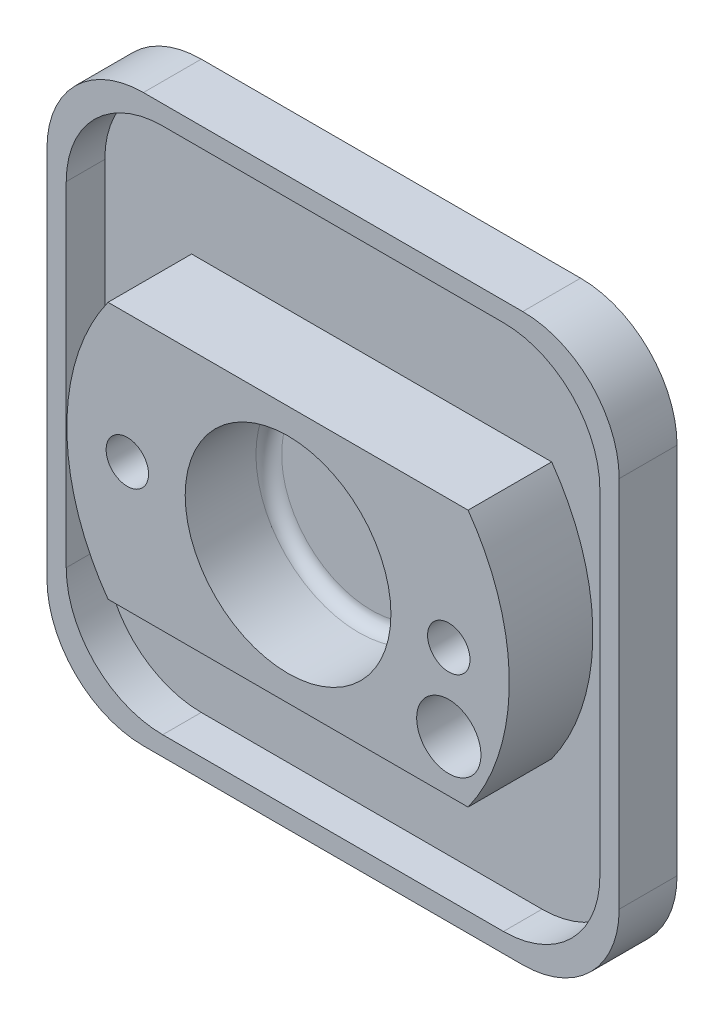
ISO-10303-21;
HEADER;
FILE_DESCRIPTION(('STEP AP214'),'2;1');
FILE_NAME('part.step','',(''),(''),'','','');
FILE_SCHEMA(('AUTOMOTIVE_DESIGN { 1 0 10303 214 1 1 1 1 }'));
ENDSEC;
DATA;
#1=APPLICATION_CONTEXT('core data for automotive mechanical design processes');
#2=APPLICATION_PROTOCOL_DEFINITION('international standard','automotive_design',2000,#1);
#3=PRODUCT_CONTEXT('',#1,'mechanical');
#4=PRODUCT('Part','Part','',(#3));
#5=PRODUCT_RELATED_PRODUCT_CATEGORY('part','',(#4));
#6=PRODUCT_DEFINITION_FORMATION('','',#4);
#7=PRODUCT_DEFINITION_CONTEXT('part definition',#1,'design');
#8=PRODUCT_DEFINITION('design','',#6,#7);
#9=PRODUCT_DEFINITION_SHAPE('','',#8);
#10=(LENGTH_UNIT() NAMED_UNIT(*) SI_UNIT(.MILLI.,.METRE.));
#11=(NAMED_UNIT(*) PLANE_ANGLE_UNIT() SI_UNIT($,.RADIAN.));
#12=(NAMED_UNIT(*) SI_UNIT($,.STERADIAN.) SOLID_ANGLE_UNIT());
#13=UNCERTAINTY_MEASURE_WITH_UNIT(LENGTH_MEASURE(1.E-05),#10,'distance_accuracy_value','');
#14=(GEOMETRIC_REPRESENTATION_CONTEXT(3) GLOBAL_UNCERTAINTY_ASSIGNED_CONTEXT((#13)) GLOBAL_UNIT_ASSIGNED_CONTEXT((#10,
#11,#12)) REPRESENTATION_CONTEXT('',''));
#15=CARTESIAN_POINT('',(0.,0.,0.));
#16=DIRECTION('',(0.,0.,1.));
#17=DIRECTION('',(1.,0.,0.));
#18=AXIS2_PLACEMENT_3D('',#15,#16,#17);
#19=CARTESIAN_POINT('',(-44.5,-44.,3.));
#20=DIRECTION('',(0.,0.,1.));
#21=DIRECTION('',(1.,0.,0.));
#22=AXIS2_PLACEMENT_3D('',#19,#20,#21);
#23=PLANE('',#22);
#24=DIRECTION('',(1.,0.,0.));
#25=VECTOR('',#24,1.);
#26=CARTESIAN_POINT('',(-44.5,-41.,3.));
#27=LINE('',#26,#25);
#28=CARTESIAN_POINT('',(-26.5,-41.,3.));
#29=VERTEX_POINT('',#28);
#30=CARTESIAN_POINT('',(26.5,-41.,3.));
#31=VERTEX_POINT('',#30);
#32=EDGE_CURVE('E200',#29,#31,#27,.T.);
#33=ORIENTED_EDGE('',*,*,#32,.T.);
#34=CARTESIAN_POINT('',(26.5,-26.,3.));
#35=DIRECTION('',(0.,0.,1.));
#36=DIRECTION('',(1.,0.,0.));
#37=AXIS2_PLACEMENT_3D('',#34,#35,#36);
#38=CIRCLE('',#37,15.);
#39=CARTESIAN_POINT('',(41.5,-26.,3.));
#40=VERTEX_POINT('',#39);
#41=EDGE_CURVE('E273',#31,#40,#38,.T.);
#42=ORIENTED_EDGE('',*,*,#41,.T.);
#43=DIRECTION('',(0.,1.,0.));
#44=VECTOR('',#43,1.);
#45=CARTESIAN_POINT('',(41.5,44.,3.));
#46=LINE('',#45,#44);
#47=CARTESIAN_POINT('',(41.5,26.,3.));
#48=VERTEX_POINT('',#47);
#49=EDGE_CURVE('E203',#40,#48,#46,.T.);
#50=ORIENTED_EDGE('',*,*,#49,.T.);
#51=CARTESIAN_POINT('',(26.5,26.,3.));
#52=DIRECTION('',(0.,0.,1.));
#53=DIRECTION('',(1.,0.,0.));
#54=AXIS2_PLACEMENT_3D('',#51,#52,#53);
#55=CIRCLE('',#54,15.);
#56=CARTESIAN_POINT('',(26.5,41.,3.));
#57=VERTEX_POINT('',#56);
#58=EDGE_CURVE('E254',#48,#57,#55,.T.);
#59=ORIENTED_EDGE('',*,*,#58,.T.);
#60=DIRECTION('',(-1.,0.,0.));
#61=VECTOR('',#60,1.);
#62=CARTESIAN_POINT('',(-44.5,41.,3.));
#63=LINE('',#62,#61);
#64=CARTESIAN_POINT('',(-26.5,41.,3.));
#65=VERTEX_POINT('',#64);
#66=EDGE_CURVE('E205',#57,#65,#63,.T.);
#67=ORIENTED_EDGE('',*,*,#66,.T.);
#68=CARTESIAN_POINT('',(-26.5,26.,3.));
#69=DIRECTION('',(0.,0.,1.));
#70=DIRECTION('',(1.,0.,0.));
#71=AXIS2_PLACEMENT_3D('',#68,#69,#70);
#72=CIRCLE('',#71,15.);
#73=CARTESIAN_POINT('',(-41.5,26.,3.));
#74=VERTEX_POINT('',#73);
#75=EDGE_CURVE('E244',#65,#74,#72,.T.);
#76=ORIENTED_EDGE('',*,*,#75,.T.);
#77=DIRECTION('',(0.,-1.,0.));
#78=VECTOR('',#77,1.);
#79=CARTESIAN_POINT('',(-41.5,44.,3.));
#80=LINE('',#79,#78);
#81=CARTESIAN_POINT('',(-41.5,-26.,3.));
#82=VERTEX_POINT('',#81);
#83=EDGE_CURVE('E165',#74,#82,#80,.T.);
#84=ORIENTED_EDGE('',*,*,#83,.T.);
#85=CARTESIAN_POINT('',(-26.5,-26.,3.));
#86=DIRECTION('',(0.,0.,1.));
#87=DIRECTION('',(1.,0.,0.));
#88=AXIS2_PLACEMENT_3D('',#85,#86,#87);
#89=CIRCLE('',#88,15.);
#90=EDGE_CURVE('E264',#82,#29,#89,.T.);
#91=ORIENTED_EDGE('',*,*,#90,.T.);
#92=EDGE_LOOP('',(#33,#42,#50,#59,#67,#76,#84,#91));
#93=FACE_BOUND('',#92,.T.);
#94=DIRECTION('',(-1.,0.,0.));
#95=VECTOR('',#94,1.);
#96=CARTESIAN_POINT('',(-28.,20.,3.));
#97=LINE('',#96,#95);
#98=CARTESIAN_POINT('',(28.,20.,3.));
#99=VERTEX_POINT('',#98);
#100=CARTESIAN_POINT('',(-28.,20.,3.));
#101=VERTEX_POINT('',#100);
#102=EDGE_CURVE('E159',#99,#101,#97,.T.);
#103=ORIENTED_EDGE('',*,*,#102,.F.);
#104=CARTESIAN_POINT('',(0.,0.,3.));
#105=DIRECTION('',(0.,0.,1.));
#106=DIRECTION('',(-1.,0.,0.));
#107=AXIS2_PLACEMENT_3D('',#104,#105,#106);
#108=CIRCLE('',#107,34.4093010681705);
#109=CARTESIAN_POINT('',(28.,-20.,3.));
#110=VERTEX_POINT('',#109);
#111=EDGE_CURVE('E170',#110,#99,#108,.T.);
#112=ORIENTED_EDGE('',*,*,#111,.F.);
#113=DIRECTION('',(1.,0.,0.));
#114=VECTOR('',#113,1.);
#115=CARTESIAN_POINT('',(-28.,-20.,3.));
#116=LINE('',#115,#114);
#117=CARTESIAN_POINT('',(-28.,-20.,3.));
#118=VERTEX_POINT('',#117);
#119=EDGE_CURVE('E182',#118,#110,#116,.T.);
#120=ORIENTED_EDGE('',*,*,#119,.F.);
#121=CARTESIAN_POINT('',(0.,0.,3.));
#122=DIRECTION('',(0.,0.,1.));
#123=DIRECTION('',(1.,0.,0.));
#124=AXIS2_PLACEMENT_3D('',#121,#122,#123);
#125=CIRCLE('',#124,34.4093010681705);
#126=EDGE_CURVE('E180',#101,#118,#125,.T.);
#127=ORIENTED_EDGE('',*,*,#126,.F.);
#128=EDGE_LOOP('',(#103,#112,#120,#127));
#129=FACE_BOUND('',#128,.T.);
#130=ADVANCED_FACE('F16',(#93,#129),#23,.T.);
#131=CARTESIAN_POINT('',(-44.5,44.,9.));
#132=DIRECTION('',(1.,0.,0.));
#133=DIRECTION('',(0.,1.,0.));
#134=AXIS2_PLACEMENT_3D('',#131,#132,#133);
#135=PLANE('',#134);
#136=DIRECTION('',(0.,-1.,0.));
#137=VECTOR('',#136,1.);
#138=CARTESIAN_POINT('',(-44.5,44.,0.));
#139=LINE('',#138,#137);
#140=CARTESIAN_POINT('',(-44.5,29.,0.));
#141=VERTEX_POINT('',#140);
#142=CARTESIAN_POINT('',(-44.5,-29.,0.));
#143=VERTEX_POINT('',#142);
#144=EDGE_CURVE('E217',#141,#143,#139,.T.);
#145=ORIENTED_EDGE('',*,*,#144,.T.);
#146=DIRECTION('',(0.,0.,-1.));
#147=VECTOR('',#146,1.);
#148=CARTESIAN_POINT('',(-44.5,-29.,9.));
#149=LINE('',#148,#147);
#150=CARTESIAN_POINT('',(-44.5,-29.,9.));
#151=VERTEX_POINT('',#150);
#152=EDGE_CURVE('E31',#143,#151,#149,.F.);
#153=ORIENTED_EDGE('',*,*,#152,.T.);
#154=DIRECTION('',(0.,-1.,0.));
#155=VECTOR('',#154,1.);
#156=CARTESIAN_POINT('',(-44.5,44.,9.));
#157=LINE('',#156,#155);
#158=CARTESIAN_POINT('',(-44.5,29.,9.));
#159=VERTEX_POINT('',#158);
#160=EDGE_CURVE('E226',#159,#151,#157,.T.);
#161=ORIENTED_EDGE('',*,*,#160,.F.);
#162=DIRECTION('',(0.,0.,-1.));
#163=VECTOR('',#162,1.);
#164=CARTESIAN_POINT('',(-44.5,29.,9.));
#165=LINE('',#164,#163);
#166=EDGE_CURVE('E301',#159,#141,#165,.T.);
#167=ORIENTED_EDGE('',*,*,#166,.T.);
#168=EDGE_LOOP('',(#145,#153,#161,#167));
#169=FACE_BOUND('',#168,.T.);
#170=ADVANCED_FACE('F18',(#169),#135,.F.);
#171=CARTESIAN_POINT('',(-44.5,-44.,9.));
#172=DIRECTION('',(0.,1.,0.));
#173=DIRECTION('',(0.,0.,1.));
#174=AXIS2_PLACEMENT_3D('',#171,#172,#173);
#175=PLANE('',#174);
#176=DIRECTION('',(1.,0.,0.));
#177=VECTOR('',#176,1.);
#178=CARTESIAN_POINT('',(-44.5,-44.,9.));
#179=LINE('',#178,#177);
#180=CARTESIAN_POINT('',(-29.5,-44.,9.));
#181=VERTEX_POINT('',#180);
#182=CARTESIAN_POINT('',(29.5,-44.,9.));
#183=VERTEX_POINT('',#182);
#184=EDGE_CURVE('E228',#181,#183,#179,.T.);
#185=ORIENTED_EDGE('',*,*,#184,.F.);
#186=DIRECTION('',(0.,0.,-1.));
#187=VECTOR('',#186,1.);
#188=CARTESIAN_POINT('',(-29.5,-44.,9.));
#189=LINE('',#188,#187);
#190=CARTESIAN_POINT('',(-29.5,-44.,0.));
#191=VERTEX_POINT('',#190);
#192=EDGE_CURVE('E310',#181,#191,#189,.T.);
#193=ORIENTED_EDGE('',*,*,#192,.T.);
#194=DIRECTION('',(1.,0.,0.));
#195=VECTOR('',#194,1.);
#196=CARTESIAN_POINT('',(-44.5,-44.,0.));
#197=LINE('',#196,#195);
#198=CARTESIAN_POINT('',(29.5,-44.,0.));
#199=VERTEX_POINT('',#198);
#200=EDGE_CURVE('E219',#191,#199,#197,.T.);
#201=ORIENTED_EDGE('',*,*,#200,.T.);
#202=DIRECTION('',(0.,0.,-1.));
#203=VECTOR('',#202,1.);
#204=CARTESIAN_POINT('',(29.5,-44.,9.));
#205=LINE('',#204,#203);
#206=EDGE_CURVE('E296',#199,#183,#205,.F.);
#207=ORIENTED_EDGE('',*,*,#206,.T.);
#208=EDGE_LOOP('',(#185,#193,#201,#207));
#209=FACE_BOUND('',#208,.T.);
#210=ADVANCED_FACE('F368',(#209),#175,.F.);
#211=CARTESIAN_POINT('',(44.5,44.,9.));
#212=DIRECTION('',(-1.,0.,0.));
#213=DIRECTION('',(0.,-1.,0.));
#214=AXIS2_PLACEMENT_3D('',#211,#212,#213);
#215=PLANE('',#214);
#216=DIRECTION('',(0.,1.,0.));
#217=VECTOR('',#216,1.);
#218=CARTESIAN_POINT('',(44.5,44.,9.));
#219=LINE('',#218,#217);
#220=CARTESIAN_POINT('',(44.5,-29.,9.));
#221=VERTEX_POINT('',#220);
#222=CARTESIAN_POINT('',(44.5,29.,9.));
#223=VERTEX_POINT('',#222);
#224=EDGE_CURVE('E230',#221,#223,#219,.T.);
#225=ORIENTED_EDGE('',*,*,#224,.F.);
#226=DIRECTION('',(0.,0.,-1.));
#227=VECTOR('',#226,1.);
#228=CARTESIAN_POINT('',(44.5,-29.,9.));
#229=LINE('',#228,#227);
#230=CARTESIAN_POINT('',(44.5,-29.,0.));
#231=VERTEX_POINT('',#230);
#232=EDGE_CURVE('E290',#221,#231,#229,.T.);
#233=ORIENTED_EDGE('',*,*,#232,.T.);
#234=DIRECTION('',(0.,1.,0.));
#235=VECTOR('',#234,1.);
#236=CARTESIAN_POINT('',(44.5,44.,0.));
#237=LINE('',#236,#235);
#238=CARTESIAN_POINT('',(44.5,29.,0.));
#239=VERTEX_POINT('',#238);
#240=EDGE_CURVE('E221',#231,#239,#237,.T.);
#241=ORIENTED_EDGE('',*,*,#240,.T.);
#242=DIRECTION('',(0.,0.,-1.));
#243=VECTOR('',#242,1.);
#244=CARTESIAN_POINT('',(44.5,29.,9.));
#245=LINE('',#244,#243);
#246=EDGE_CURVE('E285',#239,#223,#245,.F.);
#247=ORIENTED_EDGE('',*,*,#246,.T.);
#248=EDGE_LOOP('',(#225,#233,#241,#247));
#249=FACE_BOUND('',#248,.T.);
#250=ADVANCED_FACE('F390',(#249),#215,.F.);
#251=CARTESIAN_POINT('',(-44.5,44.,9.));
#252=DIRECTION('',(0.,-1.,0.));
#253=DIRECTION('',(0.,0.,-1.));
#254=AXIS2_PLACEMENT_3D('',#251,#252,#253);
#255=PLANE('',#254);
#256=DIRECTION('',(-1.,0.,0.));
#257=VECTOR('',#256,1.);
#258=CARTESIAN_POINT('',(-44.5,44.,0.));
#259=LINE('',#258,#257);
#260=CARTESIAN_POINT('',(29.5,44.,0.));
#261=VERTEX_POINT('',#260);
#262=CARTESIAN_POINT('',(-29.5,44.,0.));
#263=VERTEX_POINT('',#262);
#264=EDGE_CURVE('E223',#261,#263,#259,.T.);
#265=ORIENTED_EDGE('',*,*,#264,.T.);
#266=DIRECTION('',(0.,0.,-1.));
#267=VECTOR('',#266,1.);
#268=CARTESIAN_POINT('',(-29.5,44.,9.));
#269=LINE('',#268,#267);
#270=CARTESIAN_POINT('',(-29.5,44.,9.));
#271=VERTEX_POINT('',#270);
#272=EDGE_CURVE('E306',#263,#271,#269,.F.);
#273=ORIENTED_EDGE('',*,*,#272,.T.);
#274=DIRECTION('',(-1.,0.,0.));
#275=VECTOR('',#274,1.);
#276=CARTESIAN_POINT('',(-44.5,44.,9.));
#277=LINE('',#276,#275);
#278=CARTESIAN_POINT('',(29.5,44.,9.));
#279=VERTEX_POINT('',#278);
#280=EDGE_CURVE('E232',#279,#271,#277,.T.);
#281=ORIENTED_EDGE('',*,*,#280,.F.);
#282=DIRECTION('',(0.,0.,-1.));
#283=VECTOR('',#282,1.);
#284=CARTESIAN_POINT('',(29.5,44.,9.));
#285=LINE('',#284,#283);
#286=EDGE_CURVE('E279',#279,#261,#285,.T.);
#287=ORIENTED_EDGE('',*,*,#286,.T.);
#288=EDGE_LOOP('',(#265,#273,#281,#287));
#289=FACE_BOUND('',#288,.T.);
#290=ADVANCED_FACE('F381',(#289),#255,.F.);
#291=CARTESIAN_POINT('',(-44.5,-44.,9.));
#292=DIRECTION('',(0.,0.,1.));
#293=DIRECTION('',(1.,0.,0.));
#294=AXIS2_PLACEMENT_3D('',#291,#292,#293);
#295=PLANE('',#294);
#296=DIRECTION('',(0.,-1.,0.));
#297=VECTOR('',#296,1.);
#298=CARTESIAN_POINT('',(-41.5,44.,9.));
#299=LINE('',#298,#297);
#300=CARTESIAN_POINT('',(-41.5,26.,9.));
#301=VERTEX_POINT('',#300);
#302=CARTESIAN_POINT('',(-41.5,-26.,9.));
#303=VERTEX_POINT('',#302);
#304=EDGE_CURVE('E207',#301,#303,#299,.T.);
#305=ORIENTED_EDGE('',*,*,#304,.F.);
#306=CARTESIAN_POINT('',(-26.5,26.,9.));
#307=DIRECTION('',(0.,0.,1.));
#308=DIRECTION('',(1.,0.,0.));
#309=AXIS2_PLACEMENT_3D('',#306,#307,#308);
#310=CIRCLE('',#309,15.);
#311=CARTESIAN_POINT('',(-26.5,41.,9.));
#312=VERTEX_POINT('',#311);
#313=EDGE_CURVE('E248',#301,#312,#310,.F.);
#314=ORIENTED_EDGE('',*,*,#313,.T.);
#315=DIRECTION('',(-1.,0.,0.));
#316=VECTOR('',#315,1.);
#317=CARTESIAN_POINT('',(-44.5,41.,9.));
#318=LINE('',#317,#316);
#319=CARTESIAN_POINT('',(26.5,41.,9.));
#320=VERTEX_POINT('',#319);
#321=EDGE_CURVE('E215',#320,#312,#318,.T.);
#322=ORIENTED_EDGE('',*,*,#321,.F.);
#323=CARTESIAN_POINT('',(26.5,26.,9.));
#324=DIRECTION('',(0.,0.,1.));
#325=DIRECTION('',(1.,0.,0.));
#326=AXIS2_PLACEMENT_3D('',#323,#324,#325);
#327=CIRCLE('',#326,15.);
#328=CARTESIAN_POINT('',(41.5,26.,9.));
#329=VERTEX_POINT('',#328);
#330=EDGE_CURVE('E258',#320,#329,#327,.F.);
#331=ORIENTED_EDGE('',*,*,#330,.T.);
#332=DIRECTION('',(0.,1.,0.));
#333=VECTOR('',#332,1.);
#334=CARTESIAN_POINT('',(41.5,44.,9.));
#335=LINE('',#334,#333);
#336=CARTESIAN_POINT('',(41.5,-26.,9.));
#337=VERTEX_POINT('',#336);
#338=EDGE_CURVE('E213',#337,#329,#335,.T.);
#339=ORIENTED_EDGE('',*,*,#338,.F.);
#340=CARTESIAN_POINT('',(26.5,-26.,9.));
#341=DIRECTION('',(0.,0.,1.));
#342=DIRECTION('',(1.,0.,0.));
#343=AXIS2_PLACEMENT_3D('',#340,#341,#342);
#344=CIRCLE('',#343,15.);
#345=CARTESIAN_POINT('',(26.5,-41.,9.));
#346=VERTEX_POINT('',#345);
#347=EDGE_CURVE('E277',#337,#346,#344,.F.);
#348=ORIENTED_EDGE('',*,*,#347,.T.);
#349=DIRECTION('',(1.,0.,0.));
#350=VECTOR('',#349,1.);
#351=CARTESIAN_POINT('',(-44.5,-41.,9.));
#352=LINE('',#351,#350);
#353=CARTESIAN_POINT('',(-26.5,-41.,9.));
#354=VERTEX_POINT('',#353);
#355=EDGE_CURVE('E210',#354,#346,#352,.T.);
#356=ORIENTED_EDGE('',*,*,#355,.F.);
#357=CARTESIAN_POINT('',(-26.5,-26.,9.));
#358=DIRECTION('',(0.,0.,1.));
#359=DIRECTION('',(1.,0.,0.));
#360=AXIS2_PLACEMENT_3D('',#357,#358,#359);
#361=CIRCLE('',#360,15.);
#362=EDGE_CURVE('E268',#354,#303,#361,.F.);
#363=ORIENTED_EDGE('',*,*,#362,.T.);
#364=EDGE_LOOP('',(#305,#314,#322,#331,#339,#348,#356,#363));
#365=FACE_BOUND('',#364,.T.);
#366=ORIENTED_EDGE('',*,*,#160,.T.);
#367=CARTESIAN_POINT('',(-29.5,-29.,9.));
#368=DIRECTION('',(0.,0.,1.));
#369=DIRECTION('',(1.,0.,0.));
#370=AXIS2_PLACEMENT_3D('',#367,#368,#369);
#371=CIRCLE('',#370,15.);
#372=EDGE_CURVE('E315',#151,#181,#371,.T.);
#373=ORIENTED_EDGE('',*,*,#372,.T.);
#374=ORIENTED_EDGE('',*,*,#184,.T.);
#375=CARTESIAN_POINT('',(29.5,-29.,9.));
#376=DIRECTION('',(0.,0.,1.));
#377=DIRECTION('',(1.,0.,0.));
#378=AXIS2_PLACEMENT_3D('',#375,#376,#377);
#379=CIRCLE('',#378,15.);
#380=EDGE_CURVE('E299',#183,#221,#379,.T.);
#381=ORIENTED_EDGE('',*,*,#380,.T.);
#382=ORIENTED_EDGE('',*,*,#224,.T.);
#383=CARTESIAN_POINT('',(29.5,29.,9.));
#384=DIRECTION('',(0.,0.,1.));
#385=DIRECTION('',(1.,0.,0.));
#386=AXIS2_PLACEMENT_3D('',#383,#384,#385);
#387=CIRCLE('',#386,15.);
#388=EDGE_CURVE('E288',#223,#279,#387,.T.);
#389=ORIENTED_EDGE('',*,*,#388,.T.);
#390=ORIENTED_EDGE('',*,*,#280,.T.);
#391=CARTESIAN_POINT('',(-29.5,29.,9.));
#392=DIRECTION('',(0.,0.,1.));
#393=DIRECTION('',(1.,0.,0.));
#394=AXIS2_PLACEMENT_3D('',#391,#392,#393);
#395=CIRCLE('',#394,15.);
#396=EDGE_CURVE('E308',#271,#159,#395,.T.);
#397=ORIENTED_EDGE('',*,*,#396,.T.);
#398=EDGE_LOOP('',(#366,#373,#374,#381,#382,#389,#390,#397));
#399=FACE_BOUND('',#398,.T.);
#400=ADVANCED_FACE('F362',(#365,#399),#295,.T.);
#401=CARTESIAN_POINT('',(-44.5,-44.,0.));
#402=DIRECTION('',(0.,0.,1.));
#403=DIRECTION('',(1.,0.,0.));
#404=AXIS2_PLACEMENT_3D('',#401,#402,#403);
#405=PLANE('',#404);
#406=CARTESIAN_POINT('',(25.,0.,0.));
#407=DIRECTION('',(0.,0.,1.));
#408=DIRECTION('',(1.,0.,0.));
#409=AXIS2_PLACEMENT_3D('',#406,#407,#408);
#410=CIRCLE('',#409,6.3);
#411=CARTESIAN_POINT('',(31.3,0.,0.));
#412=VERTEX_POINT('',#411);
#413=EDGE_CURVE('E24',#412,#412,#410,.T.);
#414=ORIENTED_EDGE('',*,*,#413,.T.);
#415=EDGE_LOOP('',(#414));
#416=FACE_BOUND('',#415,.T.);
#417=CARTESIAN_POINT('',(-25.,0.,0.));
#418=DIRECTION('',(0.,0.,1.));
#419=DIRECTION('',(1.,0.,0.));
#420=AXIS2_PLACEMENT_3D('',#417,#418,#419);
#421=CIRCLE('',#420,6.3);
#422=CARTESIAN_POINT('',(-18.7,0.,0.));
#423=VERTEX_POINT('',#422);
#424=EDGE_CURVE('E320',#423,#423,#421,.T.);
#425=ORIENTED_EDGE('',*,*,#424,.T.);
#426=EDGE_LOOP('',(#425));
#427=FACE_BOUND('',#426,.T.);
#428=CARTESIAN_POINT('',(25.,-12.,0.));
#429=DIRECTION('',(0.,0.,-1.));
#430=DIRECTION('',(-1.,0.,0.));
#431=AXIS2_PLACEMENT_3D('',#428,#429,#430);
#432=CIRCLE('',#431,5.);
#433=CARTESIAN_POINT('',(20.,-12.,0.));
#434=VERTEX_POINT('',#433);
#435=EDGE_CURVE('E355',#434,#434,#432,.T.);
#436=ORIENTED_EDGE('',*,*,#435,.F.);
#437=EDGE_LOOP('',(#436));
#438=FACE_BOUND('',#437,.T.);
#439=ORIENTED_EDGE('',*,*,#200,.F.);
#440=CARTESIAN_POINT('',(-29.5,-29.,0.));
#441=DIRECTION('',(0.,0.,1.));
#442=DIRECTION('',(1.,0.,0.));
#443=AXIS2_PLACEMENT_3D('',#440,#441,#442);
#444=CIRCLE('',#443,15.);
#445=EDGE_CURVE('E39',#191,#143,#444,.F.);
#446=ORIENTED_EDGE('',*,*,#445,.T.);
#447=ORIENTED_EDGE('',*,*,#144,.F.);
#448=CARTESIAN_POINT('',(-29.5,29.,0.));
#449=DIRECTION('',(0.,0.,1.));
#450=DIRECTION('',(1.,0.,0.));
#451=AXIS2_PLACEMENT_3D('',#448,#449,#450);
#452=CIRCLE('',#451,15.);
#453=EDGE_CURVE('E304',#141,#263,#452,.F.);
#454=ORIENTED_EDGE('',*,*,#453,.T.);
#455=ORIENTED_EDGE('',*,*,#264,.F.);
#456=CARTESIAN_POINT('',(29.5,29.,0.));
#457=DIRECTION('',(0.,0.,1.));
#458=DIRECTION('',(1.,0.,0.));
#459=AXIS2_PLACEMENT_3D('',#456,#457,#458);
#460=CIRCLE('',#459,15.);
#461=EDGE_CURVE('E282',#261,#239,#460,.F.);
#462=ORIENTED_EDGE('',*,*,#461,.T.);
#463=ORIENTED_EDGE('',*,*,#240,.F.);
#464=CARTESIAN_POINT('',(29.5,-29.,0.));
#465=DIRECTION('',(0.,0.,1.));
#466=DIRECTION('',(1.,0.,0.));
#467=AXIS2_PLACEMENT_3D('',#464,#465,#466);
#468=CIRCLE('',#467,15.);
#469=EDGE_CURVE('E293',#231,#199,#468,.F.);
#470=ORIENTED_EDGE('',*,*,#469,.T.);
#471=EDGE_LOOP('',(#439,#446,#447,#454,#455,#462,#463,#470));
#472=FACE_BOUND('',#471,.T.);
#473=ADVANCED_FACE('F325',(#416,#427,#438,#472),#405,.F.);
#474=CARTESIAN_POINT('',(-41.5,44.,9.));
#475=DIRECTION('',(1.,0.,0.));
#476=DIRECTION('',(0.,1.,0.));
#477=AXIS2_PLACEMENT_3D('',#474,#475,#476);
#478=PLANE('',#477);
#479=ORIENTED_EDGE('',*,*,#304,.T.);
#480=DIRECTION('',(0.,0.,-1.));
#481=VECTOR('',#480,1.);
#482=CARTESIAN_POINT('',(-41.5,-26.,3.));
#483=LINE('',#482,#481);
#484=EDGE_CURVE('E261',#303,#82,#483,.T.);
#485=ORIENTED_EDGE('',*,*,#484,.T.);
#486=ORIENTED_EDGE('',*,*,#83,.F.);
#487=DIRECTION('',(0.,0.,-1.));
#488=VECTOR('',#487,1.);
#489=CARTESIAN_POINT('',(-41.5,26.,9.));
#490=LINE('',#489,#488);
#491=EDGE_CURVE('E246',#74,#301,#490,.F.);
#492=ORIENTED_EDGE('',*,*,#491,.T.);
#493=EDGE_LOOP('',(#479,#485,#486,#492));
#494=FACE_BOUND('',#493,.T.);
#495=ADVANCED_FACE('F361',(#494),#478,.T.);
#496=CARTESIAN_POINT('',(-44.5,-41.,9.));
#497=DIRECTION('',(0.,1.,0.));
#498=DIRECTION('',(0.,0.,1.));
#499=AXIS2_PLACEMENT_3D('',#496,#497,#498);
#500=PLANE('',#499);
#501=ORIENTED_EDGE('',*,*,#355,.T.);
#502=DIRECTION('',(0.,0.,-1.));
#503=VECTOR('',#502,1.);
#504=CARTESIAN_POINT('',(26.5,-41.,3.));
#505=LINE('',#504,#503);
#506=EDGE_CURVE('E270',#346,#31,#505,.T.);
#507=ORIENTED_EDGE('',*,*,#506,.T.);
#508=ORIENTED_EDGE('',*,*,#32,.F.);
#509=DIRECTION('',(0.,0.,-1.));
#510=VECTOR('',#509,1.);
#511=CARTESIAN_POINT('',(-26.5,-41.,9.));
#512=LINE('',#511,#510);
#513=EDGE_CURVE('E266',#29,#354,#512,.F.);
#514=ORIENTED_EDGE('',*,*,#513,.T.);
#515=EDGE_LOOP('',(#501,#507,#508,#514));
#516=FACE_BOUND('',#515,.T.);
#517=ADVANCED_FACE('F457',(#516),#500,.T.);
#518=CARTESIAN_POINT('',(41.5,44.,9.));
#519=DIRECTION('',(-1.,0.,0.));
#520=DIRECTION('',(0.,-1.,0.));
#521=AXIS2_PLACEMENT_3D('',#518,#519,#520);
#522=PLANE('',#521);
#523=ORIENTED_EDGE('',*,*,#49,.F.);
#524=DIRECTION('',(0.,0.,-1.));
#525=VECTOR('',#524,1.);
#526=CARTESIAN_POINT('',(41.5,-26.,9.));
#527=LINE('',#526,#525);
#528=EDGE_CURVE('E275',#40,#337,#527,.F.);
#529=ORIENTED_EDGE('',*,*,#528,.T.);
#530=ORIENTED_EDGE('',*,*,#338,.T.);
#531=DIRECTION('',(0.,0.,-1.));
#532=VECTOR('',#531,1.);
#533=CARTESIAN_POINT('',(41.5,26.,3.));
#534=LINE('',#533,#532);
#535=EDGE_CURVE('E251',#329,#48,#534,.T.);
#536=ORIENTED_EDGE('',*,*,#535,.T.);
#537=EDGE_LOOP('',(#523,#529,#530,#536));
#538=FACE_BOUND('',#537,.T.);
#539=ADVANCED_FACE('F442',(#538),#522,.T.);
#540=CARTESIAN_POINT('',(-44.5,41.,9.));
#541=DIRECTION('',(0.,-1.,0.));
#542=DIRECTION('',(0.,0.,-1.));
#543=AXIS2_PLACEMENT_3D('',#540,#541,#542);
#544=PLANE('',#543);
#545=ORIENTED_EDGE('',*,*,#66,.F.);
#546=DIRECTION('',(0.,0.,-1.));
#547=VECTOR('',#546,1.);
#548=CARTESIAN_POINT('',(26.5,41.,9.));
#549=LINE('',#548,#547);
#550=EDGE_CURVE('E256',#57,#320,#549,.F.);
#551=ORIENTED_EDGE('',*,*,#550,.T.);
#552=ORIENTED_EDGE('',*,*,#321,.T.);
#553=DIRECTION('',(0.,0.,-1.));
#554=VECTOR('',#553,1.);
#555=CARTESIAN_POINT('',(-26.5,41.,3.));
#556=LINE('',#555,#554);
#557=EDGE_CURVE('E241',#312,#65,#556,.T.);
#558=ORIENTED_EDGE('',*,*,#557,.T.);
#559=EDGE_LOOP('',(#545,#551,#552,#558));
#560=FACE_BOUND('',#559,.T.);
#561=ADVANCED_FACE('F434',(#560),#544,.T.);
#562=CARTESIAN_POINT('',(0.,0.,16.));
#563=DIRECTION('',(0.,0.,-1.));
#564=DIRECTION('',(-1.,0.,0.));
#565=AXIS2_PLACEMENT_3D('',#562,#563,#564);
#566=PLANE('',#565);
#567=CARTESIAN_POINT('',(25.,-12.,16.));
#568=DIRECTION('',(0.,0.,-1.));
#569=DIRECTION('',(-1.,0.,0.));
#570=AXIS2_PLACEMENT_3D('',#567,#568,#569);
#571=CIRCLE('',#570,5.);
#572=CARTESIAN_POINT('',(20.,-12.,16.));
#573=VERTEX_POINT('',#572);
#574=EDGE_CURVE('E350',#573,#573,#571,.T.);
#575=ORIENTED_EDGE('',*,*,#574,.T.);
#576=EDGE_LOOP('',(#575));
#577=FACE_BOUND('',#576,.T.);
#578=CARTESIAN_POINT('',(-25.,0.,16.));
#579=DIRECTION('',(0.,0.,-1.));
#580=DIRECTION('',(1.,0.,0.));
#581=AXIS2_PLACEMENT_3D('',#578,#579,#580);
#582=CIRCLE('',#581,3.3);
#583=CARTESIAN_POINT('',(-21.7,0.,16.));
#584=VERTEX_POINT('',#583);
#585=EDGE_CURVE('E346',#584,#584,#582,.T.);
#586=ORIENTED_EDGE('',*,*,#585,.T.);
#587=EDGE_LOOP('',(#586));
#588=FACE_BOUND('',#587,.T.);
#589=CARTESIAN_POINT('',(25.,0.,16.));
#590=DIRECTION('',(0.,0.,-1.));
#591=DIRECTION('',(-1.,0.,0.));
#592=AXIS2_PLACEMENT_3D('',#589,#590,#591);
#593=CIRCLE('',#592,3.3);
#594=CARTESIAN_POINT('',(21.7,0.,16.));
#595=VERTEX_POINT('',#594);
#596=EDGE_CURVE('E344',#595,#595,#593,.T.);
#597=ORIENTED_EDGE('',*,*,#596,.T.);
#598=EDGE_LOOP('',(#597));
#599=FACE_BOUND('',#598,.T.);
#600=CARTESIAN_POINT('',(0.,0.,16.));
#601=DIRECTION('',(0.,0.,1.));
#602=DIRECTION('',(-1.,0.,0.));
#603=AXIS2_PLACEMENT_3D('',#600,#601,#602);
#604=CIRCLE('',#603,34.4093010681705);
#605=CARTESIAN_POINT('',(28.,-20.,16.));
#606=VERTEX_POINT('',#605);
#607=CARTESIAN_POINT('',(28.,20.,16.));
#608=VERTEX_POINT('',#607);
#609=EDGE_CURVE('E187',#606,#608,#604,.T.);
#610=ORIENTED_EDGE('',*,*,#609,.T.);
#611=DIRECTION('',(-1.,0.,0.));
#612=VECTOR('',#611,1.);
#613=CARTESIAN_POINT('',(-28.,20.,16.));
#614=LINE('',#613,#612);
#615=CARTESIAN_POINT('',(-28.,20.,16.));
#616=VERTEX_POINT('',#615);
#617=EDGE_CURVE('E161',#608,#616,#614,.T.);
#618=ORIENTED_EDGE('',*,*,#617,.T.);
#619=CARTESIAN_POINT('',(0.,0.,16.));
#620=DIRECTION('',(0.,0.,1.));
#621=DIRECTION('',(1.,0.,0.));
#622=AXIS2_PLACEMENT_3D('',#619,#620,#621);
#623=CIRCLE('',#622,34.4093010681705);
#624=CARTESIAN_POINT('',(-28.,-20.,16.));
#625=VERTEX_POINT('',#624);
#626=EDGE_CURVE('E190',#616,#625,#623,.T.);
#627=ORIENTED_EDGE('',*,*,#626,.T.);
#628=DIRECTION('',(1.,0.,0.));
#629=VECTOR('',#628,1.);
#630=CARTESIAN_POINT('',(-28.,-20.,16.));
#631=LINE('',#630,#629);
#632=EDGE_CURVE('E192',#625,#606,#631,.T.);
#633=ORIENTED_EDGE('',*,*,#632,.T.);
#634=EDGE_LOOP('',(#610,#618,#627,#633));
#635=FACE_BOUND('',#634,.T.);
#636=CARTESIAN_POINT('',(0.,0.,16.));
#637=DIRECTION('',(0.,0.,1.));
#638=DIRECTION('',(1.,0.,0.));
#639=AXIS2_PLACEMENT_3D('',#636,#637,#638);
#640=CIRCLE('',#639,16.);
#641=CARTESIAN_POINT('',(16.,0.,16.));
#642=VERTEX_POINT('',#641);
#643=EDGE_CURVE('E176',#642,#642,#640,.T.);
#644=ORIENTED_EDGE('',*,*,#643,.F.);
#645=EDGE_LOOP('',(#644));
#646=FACE_BOUND('',#645,.T.);
#647=ADVANCED_FACE('F432',(#577,#588,#599,#635,#646),#566,.F.);
#648=CARTESIAN_POINT('',(0.,0.,16.));
#649=DIRECTION('',(0.,0.,-1.));
#650=DIRECTION('',(-1.,0.,0.));
#651=AXIS2_PLACEMENT_3D('',#648,#649,#650);
#652=CYLINDRICAL_SURFACE('',#651,34.4093010681705);
#653=ORIENTED_EDGE('',*,*,#111,.T.);
#654=DIRECTION('',(0.,0.,-1.));
#655=VECTOR('',#654,1.);
#656=CARTESIAN_POINT('',(28.,20.,16.));
#657=LINE('',#656,#655);
#658=EDGE_CURVE('E154',#608,#99,#657,.T.);
#659=ORIENTED_EDGE('',*,*,#658,.F.);
#660=ORIENTED_EDGE('',*,*,#609,.F.);
#661=DIRECTION('',(0.,0.,-1.));
#662=VECTOR('',#661,1.);
#663=CARTESIAN_POINT('',(28.,-20.,16.));
#664=LINE('',#663,#662);
#665=EDGE_CURVE('E173',#606,#110,#664,.T.);
#666=ORIENTED_EDGE('',*,*,#665,.T.);
#667=EDGE_LOOP('',(#653,#659,#660,#666));
#668=FACE_BOUND('',#667,.T.);
#669=ADVANCED_FACE('F171',(#668),#652,.T.);
#670=CARTESIAN_POINT('',(-28.,20.,16.));
#671=DIRECTION('',(0.,-1.,0.));
#672=DIRECTION('',(1.,0.,0.));
#673=AXIS2_PLACEMENT_3D('',#670,#671,#672);
#674=PLANE('',#673);
#675=ORIENTED_EDGE('',*,*,#102,.T.);
#676=DIRECTION('',(0.,0.,-1.));
#677=VECTOR('',#676,1.);
#678=CARTESIAN_POINT('',(-28.,20.,16.));
#679=LINE('',#678,#677);
#680=EDGE_CURVE('E166',#616,#101,#679,.T.);
#681=ORIENTED_EDGE('',*,*,#680,.F.);
#682=ORIENTED_EDGE('',*,*,#617,.F.);
#683=ORIENTED_EDGE('',*,*,#658,.T.);
#684=EDGE_LOOP('',(#675,#681,#682,#683));
#685=FACE_BOUND('',#684,.T.);
#686=ADVANCED_FACE('F156',(#685),#674,.F.);
#687=CARTESIAN_POINT('',(0.,0.,16.));
#688=DIRECTION('',(0.,0.,-1.));
#689=DIRECTION('',(-1.,0.,0.));
#690=AXIS2_PLACEMENT_3D('',#687,#688,#689);
#691=CYLINDRICAL_SURFACE('',#690,34.4093010681705);
#692=ORIENTED_EDGE('',*,*,#126,.T.);
#693=DIRECTION('',(0.,0.,-1.));
#694=VECTOR('',#693,1.);
#695=CARTESIAN_POINT('',(-28.,-20.,16.));
#696=LINE('',#695,#694);
#697=EDGE_CURVE('E195',#625,#118,#696,.T.);
#698=ORIENTED_EDGE('',*,*,#697,.F.);
#699=ORIENTED_EDGE('',*,*,#626,.F.);
#700=ORIENTED_EDGE('',*,*,#680,.T.);
#701=EDGE_LOOP('',(#692,#698,#699,#700));
#702=FACE_BOUND('',#701,.T.);
#703=ADVANCED_FACE('F448',(#702),#691,.T.);
#704=CARTESIAN_POINT('',(-28.,-20.,16.));
#705=DIRECTION('',(0.,1.,0.));
#706=DIRECTION('',(-1.,0.,0.));
#707=AXIS2_PLACEMENT_3D('',#704,#705,#706);
#708=PLANE('',#707);
#709=ORIENTED_EDGE('',*,*,#119,.T.);
#710=ORIENTED_EDGE('',*,*,#665,.F.);
#711=ORIENTED_EDGE('',*,*,#632,.F.);
#712=ORIENTED_EDGE('',*,*,#697,.T.);
#713=EDGE_LOOP('',(#709,#710,#711,#712));
#714=FACE_BOUND('',#713,.T.);
#715=ADVANCED_FACE('F423',(#714),#708,.F.);
#716=CARTESIAN_POINT('',(0.,0.,16.));
#717=DIRECTION('',(0.,0.,-1.));
#718=DIRECTION('',(-1.,0.,0.));
#719=AXIS2_PLACEMENT_3D('',#716,#717,#718);
#720=CYLINDRICAL_SURFACE('',#719,16.);
#721=CARTESIAN_POINT('',(0.,0.,5.));
#722=DIRECTION('',(0.,0.,1.));
#723=DIRECTION('',(1.,0.,0.));
#724=AXIS2_PLACEMENT_3D('',#721,#722,#723);
#725=CIRCLE('',#724,16.);
#726=CARTESIAN_POINT('',(16.,0.,5.));
#727=VERTEX_POINT('',#726);
#728=EDGE_CURVE('E235',#727,#727,#725,.F.);
#729=ORIENTED_EDGE('',*,*,#728,.T.);
#730=EDGE_LOOP('',(#729));
#731=FACE_BOUND('',#730,.T.);
#732=ORIENTED_EDGE('',*,*,#643,.T.);
#733=EDGE_LOOP('',(#732));
#734=FACE_BOUND('',#733,.T.);
#735=ADVANCED_FACE('F414',(#731,#734),#720,.F.);
#736=CARTESIAN_POINT('',(0.,0.,3.));
#737=DIRECTION('',(0.,0.,1.));
#738=DIRECTION('',(1.,0.,0.));
#739=AXIS2_PLACEMENT_3D('',#736,#737,#738);
#740=CIRCLE('',#739,14.);
#741=CARTESIAN_POINT('',(14.,0.,3.));
#742=VERTEX_POINT('',#741);
#743=EDGE_CURVE('E238',#742,#742,#740,.T.);
#744=ORIENTED_EDGE('',*,*,#743,.T.);
#745=EDGE_LOOP('',(#744));
#746=FACE_BOUND('',#745,.T.);
#747=ADVANCED_FACE('F407',(#746),#23,.T.);
#748=CARTESIAN_POINT('',(0.,0.,5.));
#749=DIRECTION('',(0.,0.,1.));
#750=DIRECTION('',(1.,0.,0.));
#751=AXIS2_PLACEMENT_3D('',#748,#749,#750);
#752=TOROIDAL_SURFACE('',#751,14.,2.);
#753=ORIENTED_EDGE('',*,*,#743,.F.);
#754=EDGE_LOOP('',(#753));
#755=FACE_BOUND('',#754,.T.);
#756=ORIENTED_EDGE('',*,*,#728,.F.);
#757=EDGE_LOOP('',(#756));
#758=FACE_BOUND('',#757,.T.);
#759=ADVANCED_FACE('F413',(#755,#758),#752,.F.);
#760=CARTESIAN_POINT('',(-26.5,26.,9.));
#761=DIRECTION('',(0.,0.,1.));
#762=DIRECTION('',(1.,0.,0.));
#763=AXIS2_PLACEMENT_3D('',#760,#761,#762);
#764=CYLINDRICAL_SURFACE('',#763,15.);
#765=ORIENTED_EDGE('',*,*,#313,.F.);
#766=ORIENTED_EDGE('',*,*,#491,.F.);
#767=ORIENTED_EDGE('',*,*,#75,.F.);
#768=ORIENTED_EDGE('',*,*,#557,.F.);
#769=EDGE_LOOP('',(#765,#766,#767,#768));
#770=FACE_BOUND('',#769,.T.);
#771=ADVANCED_FACE('F420',(#770),#764,.F.);
#772=CARTESIAN_POINT('',(26.5,26.,9.));
#773=DIRECTION('',(0.,0.,1.));
#774=DIRECTION('',(1.,0.,0.));
#775=AXIS2_PLACEMENT_3D('',#772,#773,#774);
#776=CYLINDRICAL_SURFACE('',#775,15.);
#777=ORIENTED_EDGE('',*,*,#330,.F.);
#778=ORIENTED_EDGE('',*,*,#550,.F.);
#779=ORIENTED_EDGE('',*,*,#58,.F.);
#780=ORIENTED_EDGE('',*,*,#535,.F.);
#781=EDGE_LOOP('',(#777,#778,#779,#780));
#782=FACE_BOUND('',#781,.T.);
#783=ADVANCED_FACE('F493',(#782),#776,.F.);
#784=CARTESIAN_POINT('',(-26.5,-26.,9.));
#785=DIRECTION('',(0.,0.,1.));
#786=DIRECTION('',(1.,0.,0.));
#787=AXIS2_PLACEMENT_3D('',#784,#785,#786);
#788=CYLINDRICAL_SURFACE('',#787,15.);
#789=ORIENTED_EDGE('',*,*,#362,.F.);
#790=ORIENTED_EDGE('',*,*,#513,.F.);
#791=ORIENTED_EDGE('',*,*,#90,.F.);
#792=ORIENTED_EDGE('',*,*,#484,.F.);
#793=EDGE_LOOP('',(#789,#790,#791,#792));
#794=FACE_BOUND('',#793,.T.);
#795=ADVANCED_FACE('F481',(#794),#788,.F.);
#796=CARTESIAN_POINT('',(26.5,-26.,9.));
#797=DIRECTION('',(0.,0.,1.));
#798=DIRECTION('',(1.,0.,0.));
#799=AXIS2_PLACEMENT_3D('',#796,#797,#798);
#800=CYLINDRICAL_SURFACE('',#799,15.);
#801=ORIENTED_EDGE('',*,*,#347,.F.);
#802=ORIENTED_EDGE('',*,*,#528,.F.);
#803=ORIENTED_EDGE('',*,*,#41,.F.);
#804=ORIENTED_EDGE('',*,*,#506,.F.);
#805=EDGE_LOOP('',(#801,#802,#803,#804));
#806=FACE_BOUND('',#805,.T.);
#807=ADVANCED_FACE('F402',(#806),#800,.F.);
#808=CARTESIAN_POINT('',(29.5,29.,9.));
#809=DIRECTION('',(0.,0.,-1.));
#810=DIRECTION('',(-1.,0.,0.));
#811=AXIS2_PLACEMENT_3D('',#808,#809,#810);
#812=CYLINDRICAL_SURFACE('',#811,15.);
#813=ORIENTED_EDGE('',*,*,#388,.F.);
#814=ORIENTED_EDGE('',*,*,#246,.F.);
#815=ORIENTED_EDGE('',*,*,#461,.F.);
#816=ORIENTED_EDGE('',*,*,#286,.F.);
#817=EDGE_LOOP('',(#813,#814,#815,#816));
#818=FACE_BOUND('',#817,.T.);
#819=ADVANCED_FACE('F386',(#818),#812,.T.);
#820=CARTESIAN_POINT('',(29.5,-29.,9.));
#821=DIRECTION('',(0.,0.,-1.));
#822=DIRECTION('',(-1.,0.,0.));
#823=AXIS2_PLACEMENT_3D('',#820,#821,#822);
#824=CYLINDRICAL_SURFACE('',#823,15.);
#825=ORIENTED_EDGE('',*,*,#380,.F.);
#826=ORIENTED_EDGE('',*,*,#206,.F.);
#827=ORIENTED_EDGE('',*,*,#469,.F.);
#828=ORIENTED_EDGE('',*,*,#232,.F.);
#829=EDGE_LOOP('',(#825,#826,#827,#828));
#830=FACE_BOUND('',#829,.T.);
#831=ADVANCED_FACE('F393',(#830),#824,.T.);
#832=CARTESIAN_POINT('',(-29.5,29.,9.));
#833=DIRECTION('',(0.,0.,-1.));
#834=DIRECTION('',(-1.,0.,0.));
#835=AXIS2_PLACEMENT_3D('',#832,#833,#834);
#836=CYLINDRICAL_SURFACE('',#835,15.);
#837=ORIENTED_EDGE('',*,*,#396,.F.);
#838=ORIENTED_EDGE('',*,*,#272,.F.);
#839=ORIENTED_EDGE('',*,*,#453,.F.);
#840=ORIENTED_EDGE('',*,*,#166,.F.);
#841=EDGE_LOOP('',(#837,#838,#839,#840));
#842=FACE_BOUND('',#841,.T.);
#843=ADVANCED_FACE('F377',(#842),#836,.T.);
#844=CARTESIAN_POINT('',(-29.5,-29.,9.));
#845=DIRECTION('',(0.,0.,-1.));
#846=DIRECTION('',(-1.,0.,0.));
#847=AXIS2_PLACEMENT_3D('',#844,#845,#846);
#848=CYLINDRICAL_SURFACE('',#847,15.);
#849=ORIENTED_EDGE('',*,*,#372,.F.);
#850=ORIENTED_EDGE('',*,*,#152,.F.);
#851=ORIENTED_EDGE('',*,*,#445,.F.);
#852=ORIENTED_EDGE('',*,*,#192,.F.);
#853=EDGE_LOOP('',(#849,#850,#851,#852));
#854=FACE_BOUND('',#853,.T.);
#855=ADVANCED_FACE('F340',(#854),#848,.T.);
#856=CARTESIAN_POINT('',(25.,0.,16.));
#857=DIRECTION('',(0.,0.,-1.));
#858=DIRECTION('',(-1.,0.,0.));
#859=AXIS2_PLACEMENT_3D('',#856,#857,#858);
#860=CYLINDRICAL_SURFACE('',#859,3.3);
#861=CARTESIAN_POINT('',(25.,0.,3.00000000000006));
#862=DIRECTION('',(0.,0.,1.));
#863=DIRECTION('',(1.,0.,0.));
#864=AXIS2_PLACEMENT_3D('',#861,#862,#863);
#865=CIRCLE('',#864,3.3);
#866=CARTESIAN_POINT('',(28.3,0.,3.00000000000006));
#867=VERTEX_POINT('',#866);
#868=EDGE_CURVE('E317',#867,#867,#865,.F.);
#869=ORIENTED_EDGE('',*,*,#868,.T.);
#870=EDGE_LOOP('',(#869));
#871=FACE_BOUND('',#870,.T.);
#872=ORIENTED_EDGE('',*,*,#596,.F.);
#873=EDGE_LOOP('',(#872));
#874=FACE_BOUND('',#873,.T.);
#875=ADVANCED_FACE('F336',(#871,#874),#860,.F.);
#876=CARTESIAN_POINT('',(-25.,0.,16.));
#877=DIRECTION('',(0.,0.,-1.));
#878=DIRECTION('',(-1.,0.,0.));
#879=AXIS2_PLACEMENT_3D('',#876,#877,#878);
#880=CYLINDRICAL_SURFACE('',#879,3.3);
#881=CARTESIAN_POINT('',(-25.,0.,3.00000000000006));
#882=DIRECTION('',(0.,0.,1.));
#883=DIRECTION('',(1.,0.,0.));
#884=AXIS2_PLACEMENT_3D('',#881,#882,#883);
#885=CIRCLE('',#884,3.3);
#886=CARTESIAN_POINT('',(-21.7,0.,3.00000000000006));
#887=VERTEX_POINT('',#886);
#888=EDGE_CURVE('E11',#887,#887,#885,.F.);
#889=ORIENTED_EDGE('',*,*,#888,.T.);
#890=EDGE_LOOP('',(#889));
#891=FACE_BOUND('',#890,.T.);
#892=ORIENTED_EDGE('',*,*,#585,.F.);
#893=EDGE_LOOP('',(#892));
#894=FACE_BOUND('',#893,.T.);
#895=ADVANCED_FACE('F339',(#891,#894),#880,.F.);
#896=CARTESIAN_POINT('',(25.,-12.,16.));
#897=DIRECTION('',(0.,0.,-1.));
#898=DIRECTION('',(-1.,0.,0.));
#899=AXIS2_PLACEMENT_3D('',#896,#897,#898);
#900=CYLINDRICAL_SURFACE('',#899,5.);
#901=ORIENTED_EDGE('',*,*,#574,.F.);
#902=EDGE_LOOP('',(#901));
#903=FACE_BOUND('',#902,.T.);
#904=ORIENTED_EDGE('',*,*,#435,.T.);
#905=EDGE_LOOP('',(#904));
#906=FACE_BOUND('',#905,.T.);
#907=ADVANCED_FACE('F332',(#903,#906),#900,.F.);
#908=CARTESIAN_POINT('',(25.,0.,3.00000000000006));
#909=DIRECTION('',(0.,0.,-1.));
#910=DIRECTION('',(-1.,0.,0.));
#911=AXIS2_PLACEMENT_3D('',#908,#909,#910);
#912=CONICAL_SURFACE('',#911,3.3,0.785398163397443);
#913=ORIENTED_EDGE('',*,*,#413,.F.);
#914=EDGE_LOOP('',(#913));
#915=FACE_BOUND('',#914,.T.);
#916=ORIENTED_EDGE('',*,*,#868,.F.);
#917=EDGE_LOOP('',(#916));
#918=FACE_BOUND('',#917,.T.);
#919=ADVANCED_FACE('F328',(#915,#918),#912,.F.);
#920=CARTESIAN_POINT('',(-25.,0.,3.00000000000006));
#921=DIRECTION('',(0.,0.,-1.));
#922=DIRECTION('',(-1.,0.,0.));
#923=AXIS2_PLACEMENT_3D('',#920,#921,#922);
#924=CONICAL_SURFACE('',#923,3.3,0.785398163397443);
#925=ORIENTED_EDGE('',*,*,#424,.F.);
#926=EDGE_LOOP('',(#925));
#927=FACE_BOUND('',#926,.T.);
#928=ORIENTED_EDGE('',*,*,#888,.F.);
#929=EDGE_LOOP('',(#928));
#930=FACE_BOUND('',#929,.T.);
#931=ADVANCED_FACE('F331',(#927,#930),#924,.F.);
#932=CLOSED_SHELL('',(#130,#170,#210,#250,#290,#400,#473,#495,#517,#539,#561,#647,#669,#686,
#703,#715,#735,#747,#759,#771,#783,#795,#807,#819,#831,#843,#855,#875,#895,#907,#919,#931));
#933=MANIFOLD_SOLID_BREP('B1',#932);
#934=ADVANCED_BREP_SHAPE_REPRESENTATION('',(#18,#933),#14);
#935=SHAPE_DEFINITION_REPRESENTATION(#9,#934);
ENDSEC;
END-ISO-10303-21;
